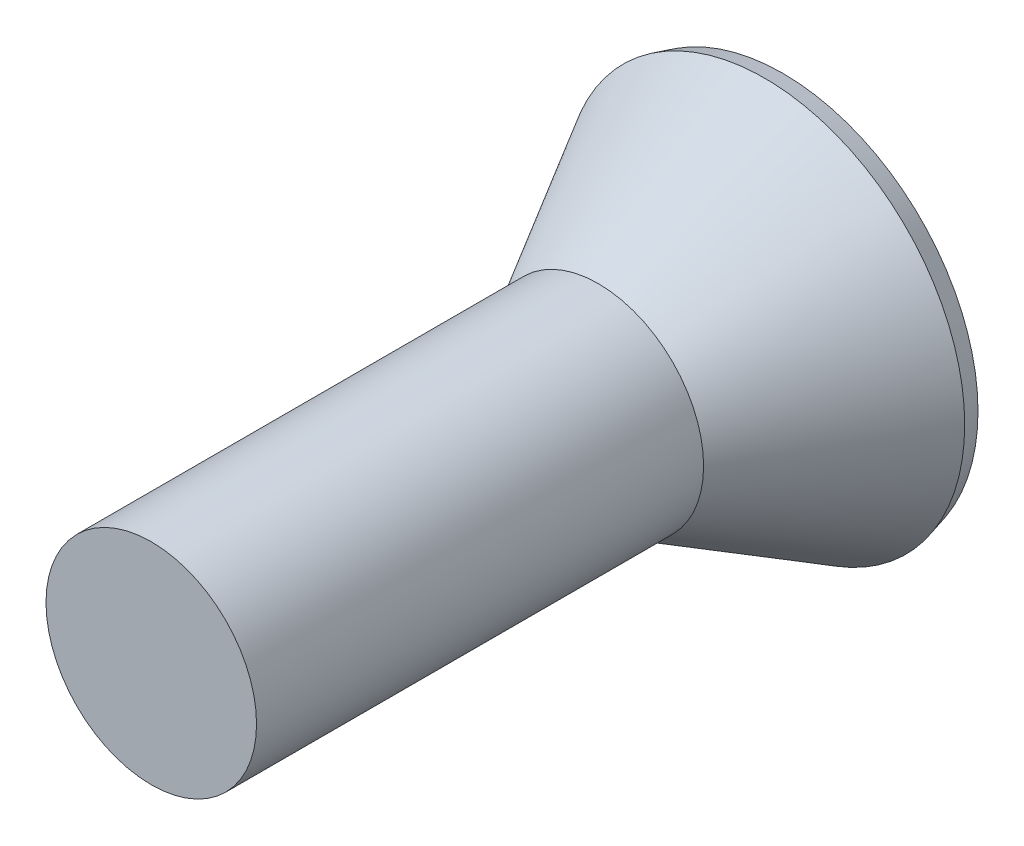
ISO-10303-21;
HEADER;
FILE_DESCRIPTION(('STEP AP214'),'2;1');
FILE_NAME('part.step','',(''),(''),'','','');
FILE_SCHEMA(('AUTOMOTIVE_DESIGN { 1 0 10303 214 1 1 1 1 }'));
ENDSEC;
DATA;
#1=APPLICATION_CONTEXT('core data for automotive mechanical design processes');
#2=APPLICATION_PROTOCOL_DEFINITION('international standard','automotive_design',2000,#1);
#3=PRODUCT_CONTEXT('',#1,'mechanical');
#4=PRODUCT('Part','Part','',(#3));
#5=PRODUCT_RELATED_PRODUCT_CATEGORY('part','',(#4));
#6=PRODUCT_DEFINITION_FORMATION('','',#4);
#7=PRODUCT_DEFINITION_CONTEXT('part definition',#1,'design');
#8=PRODUCT_DEFINITION('design','',#6,#7);
#9=PRODUCT_DEFINITION_SHAPE('','',#8);
#10=(LENGTH_UNIT() NAMED_UNIT(*) SI_UNIT(.MILLI.,.METRE.));
#11=(NAMED_UNIT(*) PLANE_ANGLE_UNIT() SI_UNIT($,.RADIAN.));
#12=(NAMED_UNIT(*) SI_UNIT($,.STERADIAN.) SOLID_ANGLE_UNIT());
#13=UNCERTAINTY_MEASURE_WITH_UNIT(LENGTH_MEASURE(1.E-05),#10,'distance_accuracy_value','');
#14=(GEOMETRIC_REPRESENTATION_CONTEXT(3) GLOBAL_UNCERTAINTY_ASSIGNED_CONTEXT((#13)) GLOBAL_UNIT_ASSIGNED_CONTEXT((#10,
#11,#12)) REPRESENTATION_CONTEXT('',''));
#15=CARTESIAN_POINT('',(0.,0.,0.));
#16=DIRECTION('',(0.,0.,1.));
#17=DIRECTION('',(1.,0.,0.));
#18=AXIS2_PLACEMENT_3D('',#15,#16,#17);
#19=CARTESIAN_POINT('',(-2.00847961466448,0.,0.00383289082605754));
#20=DIRECTION('',(0.,0.,-1.));
#21=DIRECTION('',(-1.,0.,0.));
#22=AXIS2_PLACEMENT_3D('',#19,#20,#21);
#23=PLANE('',#22);
#24=CARTESIAN_POINT('',(-0.00847961466448016,0.,0.0038328908260644));
#25=DIRECTION('',(0.,0.,-1.));
#26=DIRECTION('',(-1.,0.,0.));
#27=AXIS2_PLACEMENT_3D('',#24,#25,#26);
#28=CIRCLE('',#27,1.85338123693963);
#29=CARTESIAN_POINT('',(-1.86186085160411,0.,0.00383289082605805));
#30=VERTEX_POINT('',#29);
#31=EDGE_CURVE('E46',#30,#30,#28,.T.);
#32=ORIENTED_EDGE('',*,*,#31,.T.);
#33=EDGE_LOOP('',(#32));
#34=FACE_BOUND('',#33,.T.);
#35=DIRECTION('',(1.,0.,0.));
#36=VECTOR('',#35,1.);
#37=CARTESIAN_POINT('',(-0.441492316556699,-0.75,0.00383289082606443));
#38=LINE('',#37,#36);
#39=CARTESIAN_POINT('',(-0.441492316556699,-0.75,0.00383289082606443));
#40=VERTEX_POINT('',#39);
#41=CARTESIAN_POINT('',(0.424533087227739,-0.75,0.00383289082606589));
#42=VERTEX_POINT('',#41);
#43=EDGE_CURVE('E133',#40,#42,#38,.T.);
#44=ORIENTED_EDGE('',*,*,#43,.T.);
#45=DIRECTION('',(0.5,0.866025403784439,0.));
#46=VECTOR('',#45,1.);
#47=CARTESIAN_POINT('',(0.424533087227739,-0.75,0.00383289082606443));
#48=LINE('',#47,#46);
#49=CARTESIAN_POINT('',(0.857545789119958,0.,0.00383289082606443));
#50=VERTEX_POINT('',#49);
#51=EDGE_CURVE('E53',#42,#50,#48,.T.);
#52=ORIENTED_EDGE('',*,*,#51,.T.);
#53=DIRECTION('',(-0.5,0.866025403784438,0.));
#54=VECTOR('',#53,1.);
#55=CARTESIAN_POINT('',(0.857545789119958,0.,0.00383289082606443));
#56=LINE('',#55,#54);
#57=CARTESIAN_POINT('',(0.424533087227739,0.75,0.00383289082606443));
#58=VERTEX_POINT('',#57);
#59=EDGE_CURVE('E124',#50,#58,#56,.T.);
#60=ORIENTED_EDGE('',*,*,#59,.T.);
#61=DIRECTION('',(-1.,0.,0.));
#62=VECTOR('',#61,1.);
#63=CARTESIAN_POINT('',(0.424533087227739,0.75,0.00383289082606443));
#64=LINE('',#63,#62);
#65=CARTESIAN_POINT('',(-0.441492316556699,0.75,0.00383289082606443));
#66=VERTEX_POINT('',#65);
#67=EDGE_CURVE('E127',#58,#66,#64,.T.);
#68=ORIENTED_EDGE('',*,*,#67,.T.);
#69=DIRECTION('',(-0.5,-0.866025403784439,0.));
#70=VECTOR('',#69,1.);
#71=CARTESIAN_POINT('',(-0.441492316556699,0.75,0.00383289082606443));
#72=LINE('',#71,#70);
#73=CARTESIAN_POINT('',(-0.874505018448919,0.,0.00383289082606443));
#74=VERTEX_POINT('',#73);
#75=EDGE_CURVE('E130',#66,#74,#72,.T.);
#76=ORIENTED_EDGE('',*,*,#75,.T.);
#77=DIRECTION('',(0.5,-0.866025403784438,0.));
#78=VECTOR('',#77,1.);
#79=CARTESIAN_POINT('',(-0.874505018448919,0.,0.00383289082606443));
#80=LINE('',#79,#78);
#81=EDGE_CURVE('E114',#74,#40,#80,.T.);
#82=ORIENTED_EDGE('',*,*,#81,.T.);
#83=EDGE_LOOP('',(#44,#52,#60,#68,#76,#82));
#84=FACE_BOUND('',#83,.T.);
#85=ADVANCED_FACE('F37',(#34,#84),#23,.T.);
#86=CARTESIAN_POINT('',(-0.00847961466448016,0.,0.00383289082606784));
#87=DIRECTION('',(0.,0.,-1.));
#88=DIRECTION('',(-1.,0.,0.));
#89=AXIS2_PLACEMENT_3D('',#86,#87,#88);
#90=CONICAL_SURFACE('',#89,2.,0.518340576656532);
#91=CARTESIAN_POINT('',(-0.00847961466448076,0.,0.177561394615758));
#92=DIRECTION('',(0.,0.,1.));
#93=DIRECTION('',(1.,0.,0.));
#94=AXIS2_PLACEMENT_3D('',#91,#92,#93);
#95=CIRCLE('',#94,1.90091212500515);
#96=CARTESIAN_POINT('',(1.89243251034067,0.,0.177561394615764));
#97=VERTEX_POINT('',#96);
#98=EDGE_CURVE('E11',#97,#97,#95,.T.);
#99=ORIENTED_EDGE('',*,*,#98,.T.);
#100=EDGE_LOOP('',(#99));
#101=FACE_BOUND('',#100,.T.);
#102=CARTESIAN_POINT('',(-0.00847961466448617,0.,1.75711000771568));
#103=DIRECTION('',(0.,0.,-1.));
#104=DIRECTION('',(-1.,0.,0.));
#105=AXIS2_PLACEMENT_3D('',#102,#103,#104);
#106=CIRCLE('',#105,1.00000000000002);
#107=CARTESIAN_POINT('',(-1.0084796146645,0.,1.75711000771568));
#108=VERTEX_POINT('',#107);
#109=EDGE_CURVE('E144',#108,#108,#106,.T.);
#110=ORIENTED_EDGE('',*,*,#109,.T.);
#111=EDGE_LOOP('',(#110));
#112=FACE_BOUND('',#111,.T.);
#113=ADVANCED_FACE('F163',(#101,#112),#90,.T.);
#114=CARTESIAN_POINT('',(-1.0084796146645,0.,6.00383289082606));
#115=DIRECTION('',(0.,0.,1.));
#116=DIRECTION('',(1.,0.,0.));
#117=AXIS2_PLACEMENT_3D('',#114,#115,#116);
#118=PLANE('',#117);
#119=CARTESIAN_POINT('',(-0.00847961466450074,0.,6.00383289082606));
#120=DIRECTION('',(0.,0.,-1.));
#121=DIRECTION('',(-1.,0.,0.));
#122=AXIS2_PLACEMENT_3D('',#119,#120,#121);
#123=CIRCLE('',#122,1.);
#124=CARTESIAN_POINT('',(-1.0084796146645,0.,6.00383289082606));
#125=VERTEX_POINT('',#124);
#126=EDGE_CURVE('E147',#125,#125,#123,.T.);
#127=ORIENTED_EDGE('',*,*,#126,.F.);
#128=EDGE_LOOP('',(#127));
#129=FACE_BOUND('',#128,.T.);
#130=ADVANCED_FACE('F169',(#129),#118,.T.);
#131=CARTESIAN_POINT('',(-0.00847961466448016,0.,0.00383289082606098));
#132=DIRECTION('',(0.,0.,-1.));
#133=DIRECTION('',(-1.,0.,0.));
#134=AXIS2_PLACEMENT_3D('',#131,#132,#133);
#135=CYLINDRICAL_SURFACE('',#134,1.00000000000001);
#136=ORIENTED_EDGE('',*,*,#126,.T.);
#137=EDGE_LOOP('',(#136));
#138=FACE_BOUND('',#137,.T.);
#139=ORIENTED_EDGE('',*,*,#109,.F.);
#140=EDGE_LOOP('',(#139));
#141=FACE_BOUND('',#140,.T.);
#142=ADVANCED_FACE('F174',(#138,#141),#135,.T.);
#143=CARTESIAN_POINT('',(0.424533087227739,-0.75,1.50383289082606));
#144=DIRECTION('',(-0.866025403784439,0.5,0.));
#145=DIRECTION('',(-0.5,-0.866025403784439,0.));
#146=AXIS2_PLACEMENT_3D('',#143,#144,#145);
#147=PLANE('',#146);
#148=ORIENTED_EDGE('',*,*,#51,.F.);
#149=DIRECTION('',(0.,0.,-1.));
#150=VECTOR('',#149,1.);
#151=CARTESIAN_POINT('',(0.424533087227739,-0.75,1.50383289082606));
#152=LINE('',#151,#150);
#153=CARTESIAN_POINT('',(0.424533087227739,-0.75,1.50383289082606));
#154=VERTEX_POINT('',#153);
#155=EDGE_CURVE('E119',#154,#42,#152,.T.);
#156=ORIENTED_EDGE('',*,*,#155,.F.);
#157=DIRECTION('',(0.5,0.866025403784439,0.));
#158=VECTOR('',#157,1.);
#159=CARTESIAN_POINT('',(0.424533087227739,-0.75,1.50383289082606));
#160=LINE('',#159,#158);
#161=CARTESIAN_POINT('',(0.857545789119958,0.,1.50383289082606));
#162=VERTEX_POINT('',#161);
#163=EDGE_CURVE('E136',#154,#162,#160,.T.);
#164=ORIENTED_EDGE('',*,*,#163,.T.);
#165=DIRECTION('',(0.,0.,-1.));
#166=VECTOR('',#165,1.);
#167=CARTESIAN_POINT('',(0.857545789119958,0.,1.50383289082606));
#168=LINE('',#167,#166);
#169=EDGE_CURVE('E142',#162,#50,#168,.T.);
#170=ORIENTED_EDGE('',*,*,#169,.T.);
#171=EDGE_LOOP('',(#148,#156,#164,#170));
#172=FACE_BOUND('',#171,.T.);
#173=ADVANCED_FACE('F178',(#172),#147,.T.);
#174=CARTESIAN_POINT('',(0.857545789119958,0.,1.50383289082606));
#175=DIRECTION('',(-0.866025403784438,-0.5,0.));
#176=DIRECTION('',(0.5,-0.866025403784439,0.));
#177=AXIS2_PLACEMENT_3D('',#174,#175,#176);
#178=PLANE('',#177);
#179=ORIENTED_EDGE('',*,*,#59,.F.);
#180=ORIENTED_EDGE('',*,*,#169,.F.);
#181=DIRECTION('',(-0.5,0.866025403784438,0.));
#182=VECTOR('',#181,1.);
#183=CARTESIAN_POINT('',(0.857545789119958,0.,1.50383289082606));
#184=LINE('',#183,#182);
#185=CARTESIAN_POINT('',(0.424533087227739,0.75,1.50383289082606));
#186=VERTEX_POINT('',#185);
#187=EDGE_CURVE('E92',#162,#186,#184,.T.);
#188=ORIENTED_EDGE('',*,*,#187,.T.);
#189=DIRECTION('',(0.,0.,-1.));
#190=VECTOR('',#189,1.);
#191=CARTESIAN_POINT('',(0.424533087227739,0.75,1.50383289082606));
#192=LINE('',#191,#190);
#193=EDGE_CURVE('E140',#186,#58,#192,.T.);
#194=ORIENTED_EDGE('',*,*,#193,.T.);
#195=EDGE_LOOP('',(#179,#180,#188,#194));
#196=FACE_BOUND('',#195,.T.);
#197=ADVANCED_FACE('F182',(#196),#178,.T.);
#198=CARTESIAN_POINT('',(0.424533087227739,0.75,1.50383289082606));
#199=DIRECTION('',(0.,-1.,0.));
#200=DIRECTION('',(1.,0.,0.));
#201=AXIS2_PLACEMENT_3D('',#198,#199,#200);
#202=PLANE('',#201);
#203=ORIENTED_EDGE('',*,*,#67,.F.);
#204=ORIENTED_EDGE('',*,*,#193,.F.);
#205=DIRECTION('',(-1.,0.,0.));
#206=VECTOR('',#205,1.);
#207=CARTESIAN_POINT('',(0.424533087227739,0.75,1.50383289082606));
#208=LINE('',#207,#206);
#209=CARTESIAN_POINT('',(-0.441492316556699,0.75,1.50383289082606));
#210=VERTEX_POINT('',#209);
#211=EDGE_CURVE('E110',#186,#210,#208,.T.);
#212=ORIENTED_EDGE('',*,*,#211,.T.);
#213=DIRECTION('',(0.,0.,-1.));
#214=VECTOR('',#213,1.);
#215=CARTESIAN_POINT('',(-0.441492316556699,0.75,1.50383289082606));
#216=LINE('',#215,#214);
#217=EDGE_CURVE('E107',#210,#66,#216,.T.);
#218=ORIENTED_EDGE('',*,*,#217,.T.);
#219=EDGE_LOOP('',(#203,#204,#212,#218));
#220=FACE_BOUND('',#219,.T.);
#221=ADVANCED_FACE('F185',(#220),#202,.T.);
#222=CARTESIAN_POINT('',(-0.441492316556699,0.75,1.50383289082606));
#223=DIRECTION('',(0.866025403784439,-0.5,0.));
#224=DIRECTION('',(0.5,0.866025403784439,0.));
#225=AXIS2_PLACEMENT_3D('',#222,#223,#224);
#226=PLANE('',#225);
#227=ORIENTED_EDGE('',*,*,#75,.F.);
#228=ORIENTED_EDGE('',*,*,#217,.F.);
#229=DIRECTION('',(-0.5,-0.866025403784439,0.));
#230=VECTOR('',#229,1.);
#231=CARTESIAN_POINT('',(-0.441492316556699,0.75,1.50383289082606));
#232=LINE('',#231,#230);
#233=CARTESIAN_POINT('',(-0.874505018448919,0.,1.50383289082606));
#234=VERTEX_POINT('',#233);
#235=EDGE_CURVE('E102',#210,#234,#232,.T.);
#236=ORIENTED_EDGE('',*,*,#235,.T.);
#237=DIRECTION('',(0.,0.,-1.));
#238=VECTOR('',#237,1.);
#239=CARTESIAN_POINT('',(-0.874505018448919,0.,1.50383289082606));
#240=LINE('',#239,#238);
#241=EDGE_CURVE('E106',#234,#74,#240,.T.);
#242=ORIENTED_EDGE('',*,*,#241,.T.);
#243=EDGE_LOOP('',(#227,#228,#236,#242));
#244=FACE_BOUND('',#243,.T.);
#245=ADVANCED_FACE('F105',(#244),#226,.T.);
#246=CARTESIAN_POINT('',(-0.874505018448919,0.,1.50383289082606));
#247=DIRECTION('',(0.866025403784439,0.5,0.));
#248=DIRECTION('',(-0.5,0.866025403784439,0.));
#249=AXIS2_PLACEMENT_3D('',#246,#247,#248);
#250=PLANE('',#249);
#251=ORIENTED_EDGE('',*,*,#81,.F.);
#252=ORIENTED_EDGE('',*,*,#241,.F.);
#253=DIRECTION('',(0.5,-0.866025403784438,0.));
#254=VECTOR('',#253,1.);
#255=CARTESIAN_POINT('',(-0.874505018448919,0.,1.50383289082606));
#256=LINE('',#255,#254);
#257=CARTESIAN_POINT('',(-0.441492316556699,-0.75,1.50383289082606));
#258=VERTEX_POINT('',#257);
#259=EDGE_CURVE('E109',#234,#258,#256,.T.);
#260=ORIENTED_EDGE('',*,*,#259,.T.);
#261=DIRECTION('',(0.,0.,-1.));
#262=VECTOR('',#261,1.);
#263=CARTESIAN_POINT('',(-0.441492316556699,-0.75,1.50383289082606));
#264=LINE('',#263,#262);
#265=EDGE_CURVE('E83',#258,#40,#264,.T.);
#266=ORIENTED_EDGE('',*,*,#265,.T.);
#267=EDGE_LOOP('',(#251,#252,#260,#266));
#268=FACE_BOUND('',#267,.T.);
#269=ADVANCED_FACE('F112',(#268),#250,.T.);
#270=CARTESIAN_POINT('',(-0.441492316556699,-0.75,1.50383289082606));
#271=DIRECTION('',(0.,1.,0.));
#272=DIRECTION('',(0.,0.,1.));
#273=AXIS2_PLACEMENT_3D('',#270,#271,#272);
#274=PLANE('',#273);
#275=ORIENTED_EDGE('',*,*,#43,.F.);
#276=ORIENTED_EDGE('',*,*,#265,.F.);
#277=DIRECTION('',(1.,0.,0.));
#278=VECTOR('',#277,1.);
#279=CARTESIAN_POINT('',(-0.441492316556699,-0.75,1.50383289082606));
#280=LINE('',#279,#278);
#281=EDGE_CURVE('E61',#258,#154,#280,.T.);
#282=ORIENTED_EDGE('',*,*,#281,.T.);
#283=ORIENTED_EDGE('',*,*,#155,.T.);
#284=EDGE_LOOP('',(#275,#276,#282,#283));
#285=FACE_BOUND('',#284,.T.);
#286=ADVANCED_FACE('F159',(#285),#274,.T.);
#287=CARTESIAN_POINT('',(0.,0.,1.50383289082606));
#288=DIRECTION('',(0.,0.,1.));
#289=DIRECTION('',(1.,0.,0.));
#290=AXIS2_PLACEMENT_3D('',#287,#288,#289);
#291=PLANE('',#290);
#292=ORIENTED_EDGE('',*,*,#163,.F.);
#293=ORIENTED_EDGE('',*,*,#281,.F.);
#294=ORIENTED_EDGE('',*,*,#259,.F.);
#295=ORIENTED_EDGE('',*,*,#235,.F.);
#296=ORIENTED_EDGE('',*,*,#211,.F.);
#297=ORIENTED_EDGE('',*,*,#187,.F.);
#298=EDGE_LOOP('',(#292,#293,#294,#295,#296,#297));
#299=FACE_BOUND('',#298,.T.);
#300=ADVANCED_FACE('F117',(#299),#291,.F.);
#301=CARTESIAN_POINT('',(-0.00847961466448016,0.,0.0038328908260644));
#302=DIRECTION('',(0.,0.,1.));
#303=DIRECTION('',(1.,0.,0.));
#304=AXIS2_PLACEMENT_3D('',#301,#302,#303);
#305=CONICAL_SURFACE('',#304,1.85338123693963,0.267057586740919);
#306=ORIENTED_EDGE('',*,*,#98,.F.);
#307=EDGE_LOOP('',(#306));
#308=FACE_BOUND('',#307,.T.);
#309=ORIENTED_EDGE('',*,*,#31,.F.);
#310=EDGE_LOOP('',(#309));
#311=FACE_BOUND('',#310,.T.);
#312=ADVANCED_FACE('F40',(#308,#311),#305,.T.);
#313=CLOSED_SHELL('',(#85,#113,#130,#142,#173,#197,#221,#245,#269,#286,#300,#312));
#314=MANIFOLD_SOLID_BREP('B2',#313);
#315=ADVANCED_BREP_SHAPE_REPRESENTATION('',(#18,#314),#14);
#316=SHAPE_DEFINITION_REPRESENTATION(#9,#315);
ENDSEC;
END-ISO-10303-21;
